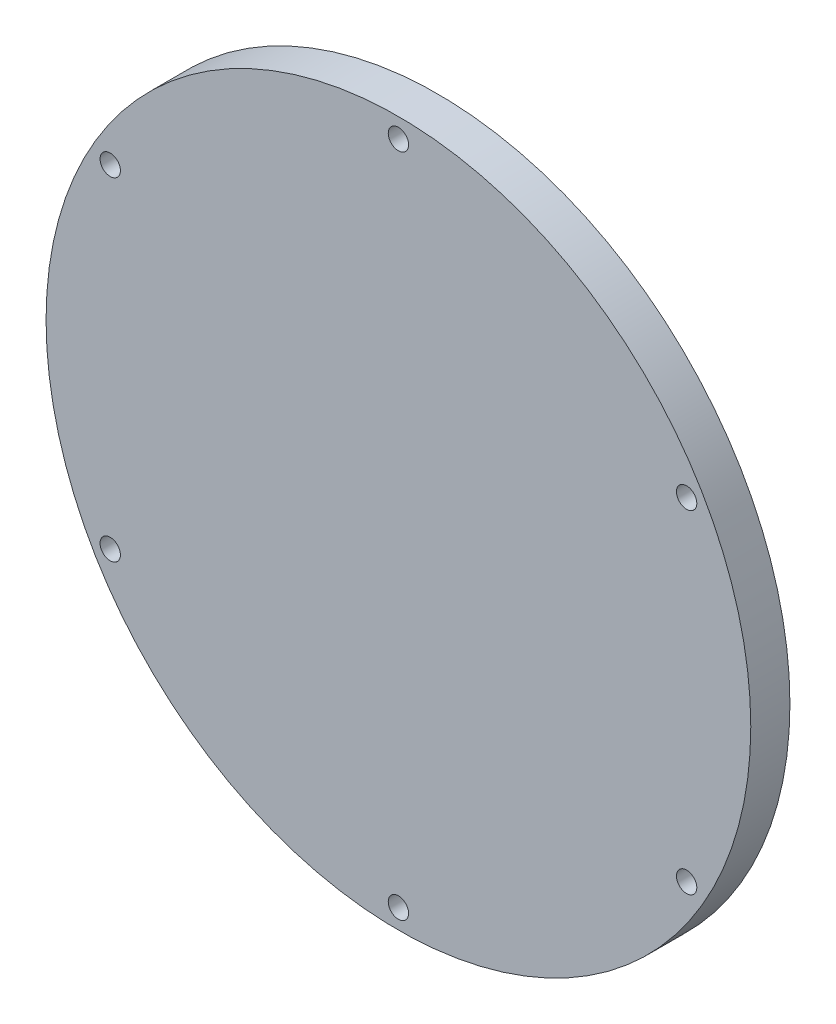
ISO-10303-21;
HEADER;
FILE_DESCRIPTION(('STEP AP214'),'2;1');
FILE_NAME('part.step','',(''),(''),'','','');
FILE_SCHEMA(('AUTOMOTIVE_DESIGN { 1 0 10303 214 1 1 1 1 }'));
ENDSEC;
DATA;
#1=APPLICATION_CONTEXT('core data for automotive mechanical design processes');
#2=APPLICATION_PROTOCOL_DEFINITION('international standard','automotive_design',2000,#1);
#3=PRODUCT_CONTEXT('',#1,'mechanical');
#4=PRODUCT('Part','Part','',(#3));
#5=PRODUCT_RELATED_PRODUCT_CATEGORY('part','',(#4));
#6=PRODUCT_DEFINITION_FORMATION('','',#4);
#7=PRODUCT_DEFINITION_CONTEXT('part definition',#1,'design');
#8=PRODUCT_DEFINITION('design','',#6,#7);
#9=PRODUCT_DEFINITION_SHAPE('','',#8);
#10=(LENGTH_UNIT() NAMED_UNIT(*) SI_UNIT(.MILLI.,.METRE.));
#11=(NAMED_UNIT(*) PLANE_ANGLE_UNIT() SI_UNIT($,.RADIAN.));
#12=(NAMED_UNIT(*) SI_UNIT($,.STERADIAN.) SOLID_ANGLE_UNIT());
#13=UNCERTAINTY_MEASURE_WITH_UNIT(LENGTH_MEASURE(1.E-05),#10,'distance_accuracy_value','');
#14=(GEOMETRIC_REPRESENTATION_CONTEXT(3) GLOBAL_UNCERTAINTY_ASSIGNED_CONTEXT((#13)) GLOBAL_UNIT_ASSIGNED_CONTEXT((#10,
#11,#12)) REPRESENTATION_CONTEXT('',''));
#15=CARTESIAN_POINT('',(0.,0.,0.));
#16=DIRECTION('',(0.,0.,1.));
#17=DIRECTION('',(1.,0.,0.));
#18=AXIS2_PLACEMENT_3D('',#15,#16,#17);
#19=CARTESIAN_POINT('',(0.,0.,6.35));
#20=DIRECTION('',(0.,0.,-1.));
#21=DIRECTION('',(-1.,0.,0.));
#22=AXIS2_PLACEMENT_3D('',#19,#20,#21);
#23=CYLINDRICAL_SURFACE('',#22,57.15);
#24=CARTESIAN_POINT('',(0.,0.,6.35));
#25=DIRECTION('',(0.,0.,1.));
#26=DIRECTION('',(1.,0.,0.));
#27=AXIS2_PLACEMENT_3D('',#24,#25,#26);
#28=CIRCLE('',#27,57.15);
#29=CARTESIAN_POINT('',(57.15,0.,6.35));
#30=VERTEX_POINT('',#29);
#31=EDGE_CURVE('E10',#30,#30,#28,.T.);
#32=ORIENTED_EDGE('',*,*,#31,.F.);
#33=EDGE_LOOP('',(#32));
#34=FACE_BOUND('',#33,.T.);
#35=CARTESIAN_POINT('',(0.,0.,0.));
#36=DIRECTION('',(0.,0.,1.));
#37=DIRECTION('',(1.,0.,0.));
#38=AXIS2_PLACEMENT_3D('',#35,#36,#37);
#39=CIRCLE('',#38,57.15);
#40=CARTESIAN_POINT('',(57.15,0.,0.));
#41=VERTEX_POINT('',#40);
#42=EDGE_CURVE('E37',#41,#41,#39,.T.);
#43=ORIENTED_EDGE('',*,*,#42,.T.);
#44=EDGE_LOOP('',(#43));
#45=FACE_BOUND('',#44,.T.);
#46=ADVANCED_FACE('F34',(#34,#45),#23,.T.);
#47=CARTESIAN_POINT('',(0.,0.,6.35));
#48=DIRECTION('',(0.,0.,1.));
#49=DIRECTION('',(1.,0.,0.));
#50=AXIS2_PLACEMENT_3D('',#47,#48,#49);
#51=PLANE('',#50);
#52=CARTESIAN_POINT('',(46.743721169262,-26.9875000000001,6.35));
#53=DIRECTION('',(0.,0.,-1.));
#54=DIRECTION('',(-1.,0.,0.));
#55=AXIS2_PLACEMENT_3D('',#52,#53,#54);
#56=CIRCLE('',#55,1.651);
#57=CARTESIAN_POINT('',(45.092721169262,-26.9875000000001,6.35));
#58=VERTEX_POINT('',#57);
#59=EDGE_CURVE('E73',#58,#58,#56,.T.);
#60=ORIENTED_EDGE('',*,*,#59,.T.);
#61=EDGE_LOOP('',(#60));
#62=FACE_BOUND('',#61,.T.);
#63=CARTESIAN_POINT('',(-4.65683562788735E-12,-53.9749999999973,6.35));
#64=DIRECTION('',(0.,0.,-1.));
#65=DIRECTION('',(-1.,0.,0.));
#66=AXIS2_PLACEMENT_3D('',#63,#64,#65);
#67=CIRCLE('',#66,1.651);
#68=CARTESIAN_POINT('',(-1.65100000000466,-53.9749999999973,6.35));
#69=VERTEX_POINT('',#68);
#70=EDGE_CURVE('E67',#69,#69,#67,.T.);
#71=ORIENTED_EDGE('',*,*,#70,.T.);
#72=EDGE_LOOP('',(#71));
#73=FACE_BOUND('',#72,.T.);
#74=CARTESIAN_POINT('',(-46.7437211692682,-26.9874999999947,6.35));
#75=DIRECTION('',(0.,0.,-1.));
#76=DIRECTION('',(-1.,0.,0.));
#77=AXIS2_PLACEMENT_3D('',#74,#75,#76);
#78=CIRCLE('',#77,1.651);
#79=CARTESIAN_POINT('',(-48.3947211692682,-26.9874999999947,6.35));
#80=VERTEX_POINT('',#79);
#81=EDGE_CURVE('E61',#80,#80,#78,.T.);
#82=ORIENTED_EDGE('',*,*,#81,.T.);
#83=EDGE_LOOP('',(#82));
#84=FACE_BOUND('',#83,.T.);
#85=CARTESIAN_POINT('',(-46.7437211692651,26.9875000000054,6.35));
#86=DIRECTION('',(0.,0.,-1.));
#87=DIRECTION('',(-1.,0.,0.));
#88=AXIS2_PLACEMENT_3D('',#85,#86,#87);
#89=CIRCLE('',#88,1.651);
#90=CARTESIAN_POINT('',(-48.3947211692651,26.9875000000054,6.35));
#91=VERTEX_POINT('',#90);
#92=EDGE_CURVE('E55',#91,#91,#89,.T.);
#93=ORIENTED_EDGE('',*,*,#92,.T.);
#94=EDGE_LOOP('',(#93));
#95=FACE_BOUND('',#94,.T.);
#96=CARTESIAN_POINT('',(1.56680147308461E-12,53.9750000000027,6.35));
#97=DIRECTION('',(0.,0.,-1.));
#98=DIRECTION('',(-1.,0.,0.));
#99=AXIS2_PLACEMENT_3D('',#96,#97,#98);
#100=CIRCLE('',#99,1.651);
#101=CARTESIAN_POINT('',(-1.65099999999843,53.9750000000027,6.35));
#102=VERTEX_POINT('',#101);
#103=EDGE_CURVE('E49',#102,#102,#100,.T.);
#104=ORIENTED_EDGE('',*,*,#103,.T.);
#105=EDGE_LOOP('',(#104));
#106=FACE_BOUND('',#105,.T.);
#107=CARTESIAN_POINT('',(46.7437211692651,26.9875,6.35));
#108=DIRECTION('',(0.,0.,-1.));
#109=DIRECTION('',(-1.,0.,0.));
#110=AXIS2_PLACEMENT_3D('',#107,#108,#109);
#111=CIRCLE('',#110,1.651);
#112=CARTESIAN_POINT('',(45.0927211692651,26.9875,6.35));
#113=VERTEX_POINT('',#112);
#114=EDGE_CURVE('E44',#113,#113,#111,.T.);
#115=ORIENTED_EDGE('',*,*,#114,.T.);
#116=EDGE_LOOP('',(#115));
#117=FACE_BOUND('',#116,.T.);
#118=ORIENTED_EDGE('',*,*,#31,.T.);
#119=EDGE_LOOP('',(#118));
#120=FACE_BOUND('',#119,.T.);
#121=ADVANCED_FACE('F82',(#62,#73,#84,#95,#106,#117,#120),#51,.T.);
#122=CARTESIAN_POINT('',(0.,0.,0.));
#123=DIRECTION('',(0.,0.,1.));
#124=DIRECTION('',(1.,0.,0.));
#125=AXIS2_PLACEMENT_3D('',#122,#123,#124);
#126=PLANE('',#125);
#127=CARTESIAN_POINT('',(46.743721169262,-26.9875000000001,0.));
#128=DIRECTION('',(0.,0.,-1.));
#129=DIRECTION('',(-1.,0.,0.));
#130=AXIS2_PLACEMENT_3D('',#127,#128,#129);
#131=CIRCLE('',#130,1.651);
#132=CARTESIAN_POINT('',(45.092721169262,-26.9875000000001,0.));
#133=VERTEX_POINT('',#132);
#134=EDGE_CURVE('E76',#133,#133,#131,.T.);
#135=ORIENTED_EDGE('',*,*,#134,.F.);
#136=EDGE_LOOP('',(#135));
#137=FACE_BOUND('',#136,.T.);
#138=CARTESIAN_POINT('',(-4.65683562788735E-12,-53.9749999999973,0.));
#139=DIRECTION('',(0.,0.,-1.));
#140=DIRECTION('',(-1.,0.,0.));
#141=AXIS2_PLACEMENT_3D('',#138,#139,#140);
#142=CIRCLE('',#141,1.651);
#143=CARTESIAN_POINT('',(-1.65100000000466,-53.9749999999973,0.));
#144=VERTEX_POINT('',#143);
#145=EDGE_CURVE('E70',#144,#144,#142,.T.);
#146=ORIENTED_EDGE('',*,*,#145,.F.);
#147=EDGE_LOOP('',(#146));
#148=FACE_BOUND('',#147,.T.);
#149=CARTESIAN_POINT('',(-46.7437211692682,-26.9874999999947,0.));
#150=DIRECTION('',(0.,0.,-1.));
#151=DIRECTION('',(-1.,0.,0.));
#152=AXIS2_PLACEMENT_3D('',#149,#150,#151);
#153=CIRCLE('',#152,1.651);
#154=CARTESIAN_POINT('',(-48.3947211692682,-26.9874999999947,0.));
#155=VERTEX_POINT('',#154);
#156=EDGE_CURVE('E64',#155,#155,#153,.T.);
#157=ORIENTED_EDGE('',*,*,#156,.F.);
#158=EDGE_LOOP('',(#157));
#159=FACE_BOUND('',#158,.T.);
#160=CARTESIAN_POINT('',(-46.7437211692651,26.9875000000054,0.));
#161=DIRECTION('',(0.,0.,-1.));
#162=DIRECTION('',(-1.,0.,0.));
#163=AXIS2_PLACEMENT_3D('',#160,#161,#162);
#164=CIRCLE('',#163,1.651);
#165=CARTESIAN_POINT('',(-48.3947211692651,26.9875000000054,0.));
#166=VERTEX_POINT('',#165);
#167=EDGE_CURVE('E58',#166,#166,#164,.T.);
#168=ORIENTED_EDGE('',*,*,#167,.F.);
#169=EDGE_LOOP('',(#168));
#170=FACE_BOUND('',#169,.T.);
#171=CARTESIAN_POINT('',(1.56680147308461E-12,53.9750000000027,0.));
#172=DIRECTION('',(0.,0.,-1.));
#173=DIRECTION('',(-1.,0.,0.));
#174=AXIS2_PLACEMENT_3D('',#171,#172,#173);
#175=CIRCLE('',#174,1.651);
#176=CARTESIAN_POINT('',(-1.65099999999843,53.9750000000027,0.));
#177=VERTEX_POINT('',#176);
#178=EDGE_CURVE('E52',#177,#177,#175,.T.);
#179=ORIENTED_EDGE('',*,*,#178,.F.);
#180=EDGE_LOOP('',(#179));
#181=FACE_BOUND('',#180,.T.);
#182=CARTESIAN_POINT('',(46.7437211692651,26.9875,0.));
#183=DIRECTION('',(0.,0.,-1.));
#184=DIRECTION('',(-1.,0.,0.));
#185=AXIS2_PLACEMENT_3D('',#182,#183,#184);
#186=CIRCLE('',#185,1.651);
#187=CARTESIAN_POINT('',(45.0927211692651,26.9875,0.));
#188=VERTEX_POINT('',#187);
#189=EDGE_CURVE('E46',#188,#188,#186,.T.);
#190=ORIENTED_EDGE('',*,*,#189,.F.);
#191=EDGE_LOOP('',(#190));
#192=FACE_BOUND('',#191,.T.);
#193=ORIENTED_EDGE('',*,*,#42,.F.);
#194=EDGE_LOOP('',(#193));
#195=FACE_BOUND('',#194,.T.);
#196=ADVANCED_FACE('F92',(#137,#148,#159,#170,#181,#192,#195),#126,.F.);
#197=CARTESIAN_POINT('',(46.7437211692651,26.9875,6.35));
#198=DIRECTION('',(0.,0.,-1.));
#199=DIRECTION('',(-1.,0.,0.));
#200=AXIS2_PLACEMENT_3D('',#197,#198,#199);
#201=CYLINDRICAL_SURFACE('',#200,1.651);
#202=ORIENTED_EDGE('',*,*,#114,.F.);
#203=EDGE_LOOP('',(#202));
#204=FACE_BOUND('',#203,.T.);
#205=ORIENTED_EDGE('',*,*,#189,.T.);
#206=EDGE_LOOP('',(#205));
#207=FACE_BOUND('',#206,.T.);
#208=ADVANCED_FACE('F95',(#204,#207),#201,.F.);
#209=CARTESIAN_POINT('',(1.56680147308461E-12,53.9750000000027,6.35));
#210=DIRECTION('',(0.,0.,-1.));
#211=DIRECTION('',(-1.,0.,0.));
#212=AXIS2_PLACEMENT_3D('',#209,#210,#211);
#213=CYLINDRICAL_SURFACE('',#212,1.651);
#214=ORIENTED_EDGE('',*,*,#103,.F.);
#215=EDGE_LOOP('',(#214));
#216=FACE_BOUND('',#215,.T.);
#217=ORIENTED_EDGE('',*,*,#178,.T.);
#218=EDGE_LOOP('',(#217));
#219=FACE_BOUND('',#218,.T.);
#220=ADVANCED_FACE('F119',(#216,#219),#213,.F.);
#221=CARTESIAN_POINT('',(-46.7437211692651,26.9875000000054,6.35));
#222=DIRECTION('',(0.,0.,-1.));
#223=DIRECTION('',(-1.,0.,0.));
#224=AXIS2_PLACEMENT_3D('',#221,#222,#223);
#225=CYLINDRICAL_SURFACE('',#224,1.651);
#226=ORIENTED_EDGE('',*,*,#92,.F.);
#227=EDGE_LOOP('',(#226));
#228=FACE_BOUND('',#227,.T.);
#229=ORIENTED_EDGE('',*,*,#167,.T.);
#230=EDGE_LOOP('',(#229));
#231=FACE_BOUND('',#230,.T.);
#232=ADVANCED_FACE('F123',(#228,#231),#225,.F.);
#233=CARTESIAN_POINT('',(-46.7437211692682,-26.9874999999947,6.35));
#234=DIRECTION('',(0.,0.,-1.));
#235=DIRECTION('',(-1.,0.,0.));
#236=AXIS2_PLACEMENT_3D('',#233,#234,#235);
#237=CYLINDRICAL_SURFACE('',#236,1.651);
#238=ORIENTED_EDGE('',*,*,#81,.F.);
#239=EDGE_LOOP('',(#238));
#240=FACE_BOUND('',#239,.T.);
#241=ORIENTED_EDGE('',*,*,#156,.T.);
#242=EDGE_LOOP('',(#241));
#243=FACE_BOUND('',#242,.T.);
#244=ADVANCED_FACE('F127',(#240,#243),#237,.F.);
#245=CARTESIAN_POINT('',(-4.65683562788735E-12,-53.9749999999973,6.35));
#246=DIRECTION('',(0.,0.,-1.));
#247=DIRECTION('',(-1.,0.,0.));
#248=AXIS2_PLACEMENT_3D('',#245,#246,#247);
#249=CYLINDRICAL_SURFACE('',#248,1.651);
#250=ORIENTED_EDGE('',*,*,#70,.F.);
#251=EDGE_LOOP('',(#250));
#252=FACE_BOUND('',#251,.T.);
#253=ORIENTED_EDGE('',*,*,#145,.T.);
#254=EDGE_LOOP('',(#253));
#255=FACE_BOUND('',#254,.T.);
#256=ADVANCED_FACE('F88',(#252,#255),#249,.F.);
#257=CARTESIAN_POINT('',(46.743721169262,-26.9875000000001,6.35));
#258=DIRECTION('',(0.,0.,-1.));
#259=DIRECTION('',(-1.,0.,0.));
#260=AXIS2_PLACEMENT_3D('',#257,#258,#259);
#261=CYLINDRICAL_SURFACE('',#260,1.651);
#262=ORIENTED_EDGE('',*,*,#59,.F.);
#263=EDGE_LOOP('',(#262));
#264=FACE_BOUND('',#263,.T.);
#265=ORIENTED_EDGE('',*,*,#134,.T.);
#266=EDGE_LOOP('',(#265));
#267=FACE_BOUND('',#266,.T.);
#268=ADVANCED_FACE('F85',(#264,#267),#261,.F.);
#269=CLOSED_SHELL('',(#46,#121,#196,#208,#220,#232,#244,#256,#268));
#270=MANIFOLD_SOLID_BREP('B2',#269);
#271=ADVANCED_BREP_SHAPE_REPRESENTATION('',(#18,#270),#14);
#272=SHAPE_DEFINITION_REPRESENTATION(#9,#271);
ENDSEC;
END-ISO-10303-21;
